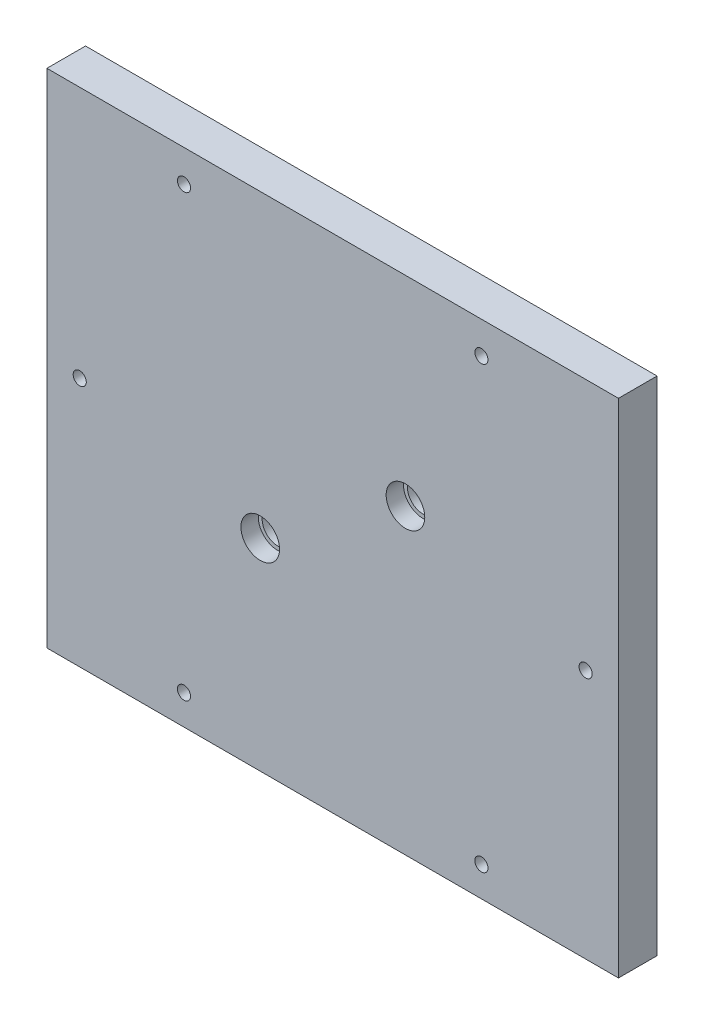
ISO-10303-21;
HEADER;
FILE_DESCRIPTION(('STEP AP214'),'2;1');
FILE_NAME('part.step','',(''),(''),'','','');
FILE_SCHEMA(('AUTOMOTIVE_DESIGN { 1 0 10303 214 1 1 1 1 }'));
ENDSEC;
DATA;
#1=APPLICATION_CONTEXT('core data for automotive mechanical design processes');
#2=APPLICATION_PROTOCOL_DEFINITION('international standard','automotive_design',2000,#1);
#3=PRODUCT_CONTEXT('',#1,'mechanical');
#4=PRODUCT('Part','Part','',(#3));
#5=PRODUCT_RELATED_PRODUCT_CATEGORY('part','',(#4));
#6=PRODUCT_DEFINITION_FORMATION('','',#4);
#7=PRODUCT_DEFINITION_CONTEXT('part definition',#1,'design');
#8=PRODUCT_DEFINITION('design','',#6,#7);
#9=PRODUCT_DEFINITION_SHAPE('','',#8);
#10=(LENGTH_UNIT() NAMED_UNIT(*) SI_UNIT(.MILLI.,.METRE.));
#11=(NAMED_UNIT(*) PLANE_ANGLE_UNIT() SI_UNIT($,.RADIAN.));
#12=(NAMED_UNIT(*) SI_UNIT($,.STERADIAN.) SOLID_ANGLE_UNIT());
#13=UNCERTAINTY_MEASURE_WITH_UNIT(LENGTH_MEASURE(1.E-05),#10,'distance_accuracy_value','');
#14=(GEOMETRIC_REPRESENTATION_CONTEXT(3) GLOBAL_UNCERTAINTY_ASSIGNED_CONTEXT((#13)) GLOBAL_UNIT_ASSIGNED_CONTEXT((#10,
#11,#12)) REPRESENTATION_CONTEXT('',''));
#15=CARTESIAN_POINT('',(0.,0.,0.));
#16=DIRECTION('',(0.,0.,1.));
#17=DIRECTION('',(1.,0.,0.));
#18=AXIS2_PLACEMENT_3D('',#15,#16,#17);
#19=CARTESIAN_POINT('',(-74.0034000000007,189.263400000001,10.));
#20=DIRECTION('',(1.00000000000001,0.,0.));
#21=DIRECTION('',(0.,1.00000000000001,0.));
#22=AXIS2_PLACEMENT_3D('',#19,#20,#21);
#23=PLANE('',#22);
#24=DIRECTION('',(0.,-1.00000000000001,0.));
#25=VECTOR('',#24,1.);
#26=CARTESIAN_POINT('',(-74.0034000000007,189.263400000001,0.));
#27=LINE('',#26,#25);
#28=CARTESIAN_POINT('',(-74.0034000000007,189.263400000001,0.));
#29=VERTEX_POINT('',#28);
#30=CARTESIAN_POINT('',(-74.0034000000003,59.2634000000003,0.));
#31=VERTEX_POINT('',#30);
#32=EDGE_CURVE('E112',#29,#31,#27,.T.);
#33=ORIENTED_EDGE('',*,*,#32,.T.);
#34=DIRECTION('',(0.,0.,-1.));
#35=VECTOR('',#34,1.);
#36=CARTESIAN_POINT('',(-74.0034000000003,59.2634000000003,10.));
#37=LINE('',#36,#35);
#38=CARTESIAN_POINT('',(-74.0034000000003,59.2634000000003,10.));
#39=VERTEX_POINT('',#38);
#40=EDGE_CURVE('E13',#39,#31,#37,.T.);
#41=ORIENTED_EDGE('',*,*,#40,.F.);
#42=DIRECTION('',(0.,-1.00000000000001,0.));
#43=VECTOR('',#42,1.);
#44=CARTESIAN_POINT('',(-74.0034000000007,189.263400000001,10.));
#45=LINE('',#44,#43);
#46=CARTESIAN_POINT('',(-74.0034000000007,189.263400000001,10.));
#47=VERTEX_POINT('',#46);
#48=EDGE_CURVE('E100',#47,#39,#45,.T.);
#49=ORIENTED_EDGE('',*,*,#48,.F.);
#50=DIRECTION('',(0.,0.,-1.));
#51=VECTOR('',#50,1.);
#52=CARTESIAN_POINT('',(-74.0034000000007,189.263400000001,10.));
#53=LINE('',#52,#51);
#54=EDGE_CURVE('E108',#47,#29,#53,.T.);
#55=ORIENTED_EDGE('',*,*,#54,.T.);
#56=EDGE_LOOP('',(#33,#41,#49,#55));
#57=FACE_BOUND('',#56,.T.);
#58=ADVANCED_FACE('F49',(#57),#23,.F.);
#59=CARTESIAN_POINT('',(-74.0034000000003,59.2634000000003,10.));
#60=DIRECTION('',(0.,1.00000000000001,0.));
#61=DIRECTION('',(0.,0.,1.));
#62=AXIS2_PLACEMENT_3D('',#59,#60,#61);
#63=PLANE('',#62);
#64=DIRECTION('',(1.00000000000001,0.,0.));
#65=VECTOR('',#64,1.);
#66=CARTESIAN_POINT('',(-74.0034000000003,59.2634000000003,0.));
#67=LINE('',#66,#65);
#68=CARTESIAN_POINT('',(73.9966000000004,59.2634,0.));
#69=VERTEX_POINT('',#68);
#70=EDGE_CURVE('E104',#31,#69,#67,.T.);
#71=ORIENTED_EDGE('',*,*,#70,.T.);
#72=DIRECTION('',(0.,0.,-1.));
#73=VECTOR('',#72,1.);
#74=CARTESIAN_POINT('',(73.9966000000004,59.2634,10.));
#75=LINE('',#74,#73);
#76=CARTESIAN_POINT('',(73.9966000000004,59.2634,10.));
#77=VERTEX_POINT('',#76);
#78=EDGE_CURVE('E57',#77,#69,#75,.T.);
#79=ORIENTED_EDGE('',*,*,#78,.F.);
#80=DIRECTION('',(1.00000000000001,0.,0.));
#81=VECTOR('',#80,1.);
#82=CARTESIAN_POINT('',(-74.0034000000003,59.2634000000003,10.));
#83=LINE('',#82,#81);
#84=EDGE_CURVE('E95',#39,#77,#83,.T.);
#85=ORIENTED_EDGE('',*,*,#84,.F.);
#86=ORIENTED_EDGE('',*,*,#40,.T.);
#87=EDGE_LOOP('',(#71,#79,#85,#86));
#88=FACE_BOUND('',#87,.T.);
#89=ADVANCED_FACE('F103',(#88),#63,.F.);
#90=CARTESIAN_POINT('',(73.9966,189.263400000001,10.));
#91=DIRECTION('',(-1.00000000000001,0.,0.));
#92=DIRECTION('',(0.,-1.00000000000001,0.));
#93=AXIS2_PLACEMENT_3D('',#90,#91,#92);
#94=PLANE('',#93);
#95=DIRECTION('',(0.,1.00000000000001,0.));
#96=VECTOR('',#95,1.);
#97=CARTESIAN_POINT('',(73.9966,189.263400000001,0.));
#98=LINE('',#97,#96);
#99=CARTESIAN_POINT('',(73.9966,189.263400000001,0.));
#100=VERTEX_POINT('',#99);
#101=EDGE_CURVE('E82',#69,#100,#98,.T.);
#102=ORIENTED_EDGE('',*,*,#101,.T.);
#103=DIRECTION('',(0.,0.,-1.));
#104=VECTOR('',#103,1.);
#105=CARTESIAN_POINT('',(73.9966,189.263400000001,10.));
#106=LINE('',#105,#104);
#107=CARTESIAN_POINT('',(73.9966,189.263400000001,10.));
#108=VERTEX_POINT('',#107);
#109=EDGE_CURVE('E105',#108,#100,#106,.T.);
#110=ORIENTED_EDGE('',*,*,#109,.F.);
#111=DIRECTION('',(0.,1.00000000000001,0.));
#112=VECTOR('',#111,1.);
#113=CARTESIAN_POINT('',(73.9966,189.263400000001,10.));
#114=LINE('',#113,#112);
#115=EDGE_CURVE('E98',#77,#108,#114,.T.);
#116=ORIENTED_EDGE('',*,*,#115,.F.);
#117=ORIENTED_EDGE('',*,*,#78,.T.);
#118=EDGE_LOOP('',(#102,#110,#116,#117));
#119=FACE_BOUND('',#118,.T.);
#120=ADVANCED_FACE('F106',(#119),#94,.F.);
#121=CARTESIAN_POINT('',(-74.0034000000007,189.263400000001,10.));
#122=DIRECTION('',(0.,-1.00000000000001,0.));
#123=DIRECTION('',(0.,0.,-1.));
#124=AXIS2_PLACEMENT_3D('',#121,#122,#123);
#125=PLANE('',#124);
#126=DIRECTION('',(-1.00000000000001,0.,0.));
#127=VECTOR('',#126,1.);
#128=CARTESIAN_POINT('',(-74.0034000000007,189.263400000001,0.));
#129=LINE('',#128,#127);
#130=EDGE_CURVE('E88',#100,#29,#129,.T.);
#131=ORIENTED_EDGE('',*,*,#130,.T.);
#132=ORIENTED_EDGE('',*,*,#54,.F.);
#133=DIRECTION('',(-1.00000000000001,0.,0.));
#134=VECTOR('',#133,1.);
#135=CARTESIAN_POINT('',(-74.0034000000007,189.263400000001,10.));
#136=LINE('',#135,#134);
#137=EDGE_CURVE('E65',#108,#47,#136,.T.);
#138=ORIENTED_EDGE('',*,*,#137,.F.);
#139=ORIENTED_EDGE('',*,*,#109,.T.);
#140=EDGE_LOOP('',(#131,#132,#138,#139));
#141=FACE_BOUND('',#140,.T.);
#142=ADVANCED_FACE('F120',(#141),#125,.F.);
#143=CARTESIAN_POINT('',(-74.0034000000003,59.2634000000003,10.));
#144=DIRECTION('',(0.,0.,1.));
#145=DIRECTION('',(1.00000000000001,0.,0.));
#146=AXIS2_PLACEMENT_3D('',#143,#144,#145);
#147=PLANE('',#146);
#148=CARTESIAN_POINT('',(18.8365999999999,137.5034,10.));
#149=DIRECTION('',(0.,0.,1.));
#150=DIRECTION('',(1.00000000000001,0.,0.));
#151=AXIS2_PLACEMENT_3D('',#148,#149,#150);
#152=CIRCLE('',#151,5.00000000000001);
#153=CARTESIAN_POINT('',(23.8366,137.5034,10.));
#154=VERTEX_POINT('',#153);
#155=EDGE_CURVE('E168',#154,#154,#152,.T.);
#156=ORIENTED_EDGE('',*,*,#155,.F.);
#157=EDGE_LOOP('',(#156));
#158=FACE_BOUND('',#157,.T.);
#159=CARTESIAN_POINT('',(-18.7634000000003,111.523400000001,10.));
#160=DIRECTION('',(0.,0.,1.));
#161=DIRECTION('',(1.00000000000001,0.,0.));
#162=AXIS2_PLACEMENT_3D('',#159,#160,#161);
#163=CIRCLE('',#162,5.);
#164=CARTESIAN_POINT('',(-13.7634000000002,111.523400000001,10.));
#165=VERTEX_POINT('',#164);
#166=EDGE_CURVE('E162',#165,#165,#163,.T.);
#167=ORIENTED_EDGE('',*,*,#166,.F.);
#168=EDGE_LOOP('',(#167));
#169=FACE_BOUND('',#168,.T.);
#170=CARTESIAN_POINT('',(38.5000000000001,67.0000000000007,10.));
#171=DIRECTION('',(0.,0.,1.));
#172=DIRECTION('',(1.00000000000001,0.,0.));
#173=AXIS2_PLACEMENT_3D('',#170,#171,#172);
#174=CIRCLE('',#173,1.7);
#175=CARTESIAN_POINT('',(40.2000000000001,67.0000000000007,10.));
#176=VERTEX_POINT('',#175);
#177=EDGE_CURVE('E158',#176,#176,#174,.T.);
#178=ORIENTED_EDGE('',*,*,#177,.F.);
#179=EDGE_LOOP('',(#178));
#180=FACE_BOUND('',#179,.T.);
#181=CARTESIAN_POINT('',(-38.5068000000002,67.0000000000007,10.));
#182=DIRECTION('',(0.,0.,1.));
#183=DIRECTION('',(1.00000000000001,0.,0.));
#184=AXIS2_PLACEMENT_3D('',#181,#182,#183);
#185=CIRCLE('',#184,1.7);
#186=CARTESIAN_POINT('',(-36.8068000000002,67.0000000000007,10.));
#187=VERTEX_POINT('',#186);
#188=EDGE_CURVE('E152',#187,#187,#185,.T.);
#189=ORIENTED_EDGE('',*,*,#188,.F.);
#190=EDGE_LOOP('',(#189));
#191=FACE_BOUND('',#190,.T.);
#192=CARTESIAN_POINT('',(65.5000000000002,124.000000000001,10.0000000000002));
#193=DIRECTION('',(0.,0.,1.));
#194=DIRECTION('',(1.00000000000001,0.,0.));
#195=AXIS2_PLACEMENT_3D('',#192,#193,#194);
#196=CIRCLE('',#195,1.69999999999999);
#197=CARTESIAN_POINT('',(67.2000000000002,124.000000000001,10.0000000000002));
#198=VERTEX_POINT('',#197);
#199=EDGE_CURVE('E146',#198,#198,#196,.T.);
#200=ORIENTED_EDGE('',*,*,#199,.F.);
#201=EDGE_LOOP('',(#200));
#202=FACE_BOUND('',#201,.T.);
#203=CARTESIAN_POINT('',(-65.5068000000005,124.000000000001,10.0000000000002));
#204=DIRECTION('',(0.,0.,1.));
#205=DIRECTION('',(1.00000000000001,0.,0.));
#206=AXIS2_PLACEMENT_3D('',#203,#204,#205);
#207=CIRCLE('',#206,1.69999999999999);
#208=CARTESIAN_POINT('',(-63.8068000000005,124.000000000001,10.0000000000002));
#209=VERTEX_POINT('',#208);
#210=EDGE_CURVE('E140',#209,#209,#207,.T.);
#211=ORIENTED_EDGE('',*,*,#210,.F.);
#212=EDGE_LOOP('',(#211));
#213=FACE_BOUND('',#212,.T.);
#214=CARTESIAN_POINT('',(-38.5068000000004,181.000000000001,10.));
#215=DIRECTION('',(0.,0.,1.));
#216=DIRECTION('',(1.00000000000001,0.,0.));
#217=AXIS2_PLACEMENT_3D('',#214,#215,#216);
#218=CIRCLE('',#217,1.7);
#219=CARTESIAN_POINT('',(-36.8068000000004,181.000000000001,10.));
#220=VERTEX_POINT('',#219);
#221=EDGE_CURVE('E134',#220,#220,#218,.T.);
#222=ORIENTED_EDGE('',*,*,#221,.F.);
#223=EDGE_LOOP('',(#222));
#224=FACE_BOUND('',#223,.T.);
#225=CARTESIAN_POINT('',(38.5,181.000000000001,10.));
#226=DIRECTION('',(0.,0.,1.));
#227=DIRECTION('',(1.00000000000001,0.,0.));
#228=AXIS2_PLACEMENT_3D('',#225,#226,#227);
#229=CIRCLE('',#228,1.7);
#230=CARTESIAN_POINT('',(40.2,181.000000000001,10.));
#231=VERTEX_POINT('',#230);
#232=EDGE_CURVE('E128',#231,#231,#229,.T.);
#233=ORIENTED_EDGE('',*,*,#232,.F.);
#234=EDGE_LOOP('',(#233));
#235=FACE_BOUND('',#234,.T.);
#236=ORIENTED_EDGE('',*,*,#48,.T.);
#237=ORIENTED_EDGE('',*,*,#84,.T.);
#238=ORIENTED_EDGE('',*,*,#115,.T.);
#239=ORIENTED_EDGE('',*,*,#137,.T.);
#240=EDGE_LOOP('',(#236,#237,#238,#239));
#241=FACE_BOUND('',#240,.T.);
#242=ADVANCED_FACE('F96',(#158,#169,#180,#191,#202,#213,#224,#235,#241),#147,.T.);
#243=CARTESIAN_POINT('',(-74.0034000000003,59.2634000000003,0.));
#244=DIRECTION('',(0.,0.,1.));
#245=DIRECTION('',(1.00000000000001,0.,0.));
#246=AXIS2_PLACEMENT_3D('',#243,#244,#245);
#247=PLANE('',#246);
#248=CARTESIAN_POINT('',(18.8365999999999,137.503400000001,0.));
#249=DIRECTION('',(0.,0.,1.));
#250=DIRECTION('',(1.00000000000001,0.,0.));
#251=AXIS2_PLACEMENT_3D('',#248,#249,#250);
#252=CIRCLE('',#251,4.);
#253=CARTESIAN_POINT('',(22.8365999999999,137.503400000001,0.));
#254=VERTEX_POINT('',#253);
#255=EDGE_CURVE('E179',#254,#254,#252,.F.);
#256=ORIENTED_EDGE('',*,*,#255,.F.);
#257=EDGE_LOOP('',(#256));
#258=FACE_BOUND('',#257,.T.);
#259=CARTESIAN_POINT('',(-18.7634000000003,111.523400000001,0.));
#260=DIRECTION('',(0.,0.,1.));
#261=DIRECTION('',(1.00000000000001,0.,0.));
#262=AXIS2_PLACEMENT_3D('',#259,#260,#261);
#263=CIRCLE('',#262,4.);
#264=CARTESIAN_POINT('',(-14.7634000000002,111.523400000001,0.));
#265=VERTEX_POINT('',#264);
#266=EDGE_CURVE('E171',#265,#265,#263,.F.);
#267=ORIENTED_EDGE('',*,*,#266,.F.);
#268=EDGE_LOOP('',(#267));
#269=FACE_BOUND('',#268,.T.);
#270=CARTESIAN_POINT('',(38.5000000000001,67.0000000000005,0.));
#271=DIRECTION('',(0.,0.,1.));
#272=DIRECTION('',(1.00000000000001,0.,0.));
#273=AXIS2_PLACEMENT_3D('',#270,#271,#272);
#274=CIRCLE('',#273,1.7);
#275=CARTESIAN_POINT('',(40.2000000000001,67.0000000000005,0.));
#276=VERTEX_POINT('',#275);
#277=EDGE_CURVE('E155',#276,#276,#274,.T.);
#278=ORIENTED_EDGE('',*,*,#277,.T.);
#279=EDGE_LOOP('',(#278));
#280=FACE_BOUND('',#279,.T.);
#281=CARTESIAN_POINT('',(-38.5068000000002,67.0000000000005,0.));
#282=DIRECTION('',(0.,0.,1.));
#283=DIRECTION('',(1.00000000000001,0.,0.));
#284=AXIS2_PLACEMENT_3D('',#281,#282,#283);
#285=CIRCLE('',#284,1.7);
#286=CARTESIAN_POINT('',(-36.8068000000002,67.0000000000005,0.));
#287=VERTEX_POINT('',#286);
#288=EDGE_CURVE('E149',#287,#287,#285,.T.);
#289=ORIENTED_EDGE('',*,*,#288,.T.);
#290=EDGE_LOOP('',(#289));
#291=FACE_BOUND('',#290,.T.);
#292=CARTESIAN_POINT('',(65.5000000000002,124.000000000001,2.22044604925031E-13));
#293=DIRECTION('',(0.,0.,1.));
#294=DIRECTION('',(1.00000000000001,0.,0.));
#295=AXIS2_PLACEMENT_3D('',#292,#293,#294);
#296=CIRCLE('',#295,1.69999999999999);
#297=CARTESIAN_POINT('',(67.2000000000002,124.000000000001,2.22044604925031E-13));
#298=VERTEX_POINT('',#297);
#299=EDGE_CURVE('E143',#298,#298,#296,.T.);
#300=ORIENTED_EDGE('',*,*,#299,.T.);
#301=EDGE_LOOP('',(#300));
#302=FACE_BOUND('',#301,.T.);
#303=CARTESIAN_POINT('',(-65.5068000000005,124.000000000001,2.22044604925031E-13));
#304=DIRECTION('',(0.,0.,1.));
#305=DIRECTION('',(1.00000000000001,0.,0.));
#306=AXIS2_PLACEMENT_3D('',#303,#304,#305);
#307=CIRCLE('',#306,1.69999999999999);
#308=CARTESIAN_POINT('',(-63.8068000000005,124.000000000001,2.22044604925031E-13));
#309=VERTEX_POINT('',#308);
#310=EDGE_CURVE('E137',#309,#309,#307,.T.);
#311=ORIENTED_EDGE('',*,*,#310,.T.);
#312=EDGE_LOOP('',(#311));
#313=FACE_BOUND('',#312,.T.);
#314=CARTESIAN_POINT('',(-38.5068000000004,181.000000000001,0.));
#315=DIRECTION('',(0.,0.,1.));
#316=DIRECTION('',(1.00000000000001,0.,0.));
#317=AXIS2_PLACEMENT_3D('',#314,#315,#316);
#318=CIRCLE('',#317,1.7);
#319=CARTESIAN_POINT('',(-36.8068000000004,181.000000000001,0.));
#320=VERTEX_POINT('',#319);
#321=EDGE_CURVE('E131',#320,#320,#318,.T.);
#322=ORIENTED_EDGE('',*,*,#321,.T.);
#323=EDGE_LOOP('',(#322));
#324=FACE_BOUND('',#323,.T.);
#325=CARTESIAN_POINT('',(38.5,181.000000000001,0.));
#326=DIRECTION('',(0.,0.,1.));
#327=DIRECTION('',(1.00000000000001,0.,0.));
#328=AXIS2_PLACEMENT_3D('',#325,#326,#327);
#329=CIRCLE('',#328,1.7);
#330=CARTESIAN_POINT('',(40.2,181.000000000001,0.));
#331=VERTEX_POINT('',#330);
#332=EDGE_CURVE('E115',#331,#331,#329,.T.);
#333=ORIENTED_EDGE('',*,*,#332,.T.);
#334=EDGE_LOOP('',(#333));
#335=FACE_BOUND('',#334,.T.);
#336=ORIENTED_EDGE('',*,*,#32,.F.);
#337=ORIENTED_EDGE('',*,*,#130,.F.);
#338=ORIENTED_EDGE('',*,*,#101,.F.);
#339=ORIENTED_EDGE('',*,*,#70,.F.);
#340=EDGE_LOOP('',(#336,#337,#338,#339));
#341=FACE_BOUND('',#340,.T.);
#342=ADVANCED_FACE('F123',(#258,#269,#280,#291,#302,#313,#324,#335,#341),#247,.F.);
#343=CARTESIAN_POINT('',(38.5,181.000000000001,10.));
#344=DIRECTION('',(0.,0.,1.));
#345=DIRECTION('',(1.00000000000001,0.,0.));
#346=AXIS2_PLACEMENT_3D('',#343,#344,#345);
#347=CYLINDRICAL_SURFACE('',#346,1.7);
#348=ORIENTED_EDGE('',*,*,#332,.F.);
#349=EDGE_LOOP('',(#348));
#350=FACE_BOUND('',#349,.T.);
#351=ORIENTED_EDGE('',*,*,#232,.T.);
#352=EDGE_LOOP('',(#351));
#353=FACE_BOUND('',#352,.T.);
#354=ADVANCED_FACE('F198',(#350,#353),#347,.F.);
#355=CARTESIAN_POINT('',(-38.5068000000004,181.000000000001,10.));
#356=DIRECTION('',(0.,0.,1.));
#357=DIRECTION('',(1.00000000000001,0.,0.));
#358=AXIS2_PLACEMENT_3D('',#355,#356,#357);
#359=CYLINDRICAL_SURFACE('',#358,1.7);
#360=ORIENTED_EDGE('',*,*,#321,.F.);
#361=EDGE_LOOP('',(#360));
#362=FACE_BOUND('',#361,.T.);
#363=ORIENTED_EDGE('',*,*,#221,.T.);
#364=EDGE_LOOP('',(#363));
#365=FACE_BOUND('',#364,.T.);
#366=ADVANCED_FACE('F216',(#362,#365),#359,.F.);
#367=CARTESIAN_POINT('',(-65.5068000000005,124.000000000001,10.0000000000002));
#368=DIRECTION('',(0.,0.,1.));
#369=DIRECTION('',(1.00000000000001,0.,0.));
#370=AXIS2_PLACEMENT_3D('',#367,#368,#369);
#371=CYLINDRICAL_SURFACE('',#370,1.69999999999999);
#372=ORIENTED_EDGE('',*,*,#310,.F.);
#373=EDGE_LOOP('',(#372));
#374=FACE_BOUND('',#373,.T.);
#375=ORIENTED_EDGE('',*,*,#210,.T.);
#376=EDGE_LOOP('',(#375));
#377=FACE_BOUND('',#376,.T.);
#378=ADVANCED_FACE('F260',(#374,#377),#371,.F.);
#379=CARTESIAN_POINT('',(65.5000000000002,124.000000000001,10.0000000000002));
#380=DIRECTION('',(0.,0.,1.));
#381=DIRECTION('',(1.00000000000001,0.,0.));
#382=AXIS2_PLACEMENT_3D('',#379,#380,#381);
#383=CYLINDRICAL_SURFACE('',#382,1.69999999999999);
#384=ORIENTED_EDGE('',*,*,#299,.F.);
#385=EDGE_LOOP('',(#384));
#386=FACE_BOUND('',#385,.T.);
#387=ORIENTED_EDGE('',*,*,#199,.T.);
#388=EDGE_LOOP('',(#387));
#389=FACE_BOUND('',#388,.T.);
#390=ADVANCED_FACE('F268',(#386,#389),#383,.F.);
#391=CARTESIAN_POINT('',(-38.5068000000002,67.0000000000007,10.));
#392=DIRECTION('',(0.,0.,1.));
#393=DIRECTION('',(1.00000000000001,0.,0.));
#394=AXIS2_PLACEMENT_3D('',#391,#392,#393);
#395=CYLINDRICAL_SURFACE('',#394,1.7);
#396=ORIENTED_EDGE('',*,*,#288,.F.);
#397=EDGE_LOOP('',(#396));
#398=FACE_BOUND('',#397,.T.);
#399=ORIENTED_EDGE('',*,*,#188,.T.);
#400=EDGE_LOOP('',(#399));
#401=FACE_BOUND('',#400,.T.);
#402=ADVANCED_FACE('F276',(#398,#401),#395,.F.);
#403=CARTESIAN_POINT('',(38.5000000000001,67.0000000000007,10.));
#404=DIRECTION('',(0.,0.,1.));
#405=DIRECTION('',(1.00000000000001,0.,0.));
#406=AXIS2_PLACEMENT_3D('',#403,#404,#405);
#407=CYLINDRICAL_SURFACE('',#406,1.7);
#408=ORIENTED_EDGE('',*,*,#277,.F.);
#409=EDGE_LOOP('',(#408));
#410=FACE_BOUND('',#409,.T.);
#411=ORIENTED_EDGE('',*,*,#177,.T.);
#412=EDGE_LOOP('',(#411));
#413=FACE_BOUND('',#412,.T.);
#414=ADVANCED_FACE('F284',(#410,#413),#407,.F.);
#415=CARTESIAN_POINT('',(-18.7634000000003,111.5234,5.50000000000001));
#416=DIRECTION('',(0.,0.,1.));
#417=DIRECTION('',(1.00000000000001,0.,0.));
#418=AXIS2_PLACEMENT_3D('',#415,#416,#417);
#419=CYLINDRICAL_SURFACE('',#418,5.);
#420=CARTESIAN_POINT('',(-18.7634000000003,111.5234,5.50000000000001));
#421=DIRECTION('',(0.,0.,1.));
#422=DIRECTION('',(1.00000000000001,0.,0.));
#423=AXIS2_PLACEMENT_3D('',#420,#421,#422);
#424=CIRCLE('',#423,5.);
#425=CARTESIAN_POINT('',(-13.7634000000002,111.5234,5.50000000000001));
#426=VERTEX_POINT('',#425);
#427=EDGE_CURVE('E161',#426,#426,#424,.T.);
#428=ORIENTED_EDGE('',*,*,#427,.F.);
#429=EDGE_LOOP('',(#428));
#430=FACE_BOUND('',#429,.T.);
#431=ORIENTED_EDGE('',*,*,#166,.T.);
#432=EDGE_LOOP('',(#431));
#433=FACE_BOUND('',#432,.T.);
#434=ADVANCED_FACE('F292',(#430,#433),#419,.F.);
#435=CARTESIAN_POINT('',(-18.7634000000003,111.5234,5.50000000000001));
#436=DIRECTION('',(0.,0.,1.));
#437=DIRECTION('',(1.00000000000001,0.,0.));
#438=AXIS2_PLACEMENT_3D('',#435,#436,#437);
#439=PLANE('',#438);
#440=CARTESIAN_POINT('',(-18.7634000000003,111.5234,5.50000000000001));
#441=DIRECTION('',(0.,0.,1.));
#442=DIRECTION('',(1.00000000000001,0.,0.));
#443=AXIS2_PLACEMENT_3D('',#440,#441,#442);
#444=CIRCLE('',#443,4.);
#445=CARTESIAN_POINT('',(-14.7634000000002,111.5234,5.50000000000001));
#446=VERTEX_POINT('',#445);
#447=EDGE_CURVE('E176',#446,#446,#444,.F.);
#448=ORIENTED_EDGE('',*,*,#447,.T.);
#449=EDGE_LOOP('',(#448));
#450=FACE_BOUND('',#449,.T.);
#451=ORIENTED_EDGE('',*,*,#427,.T.);
#452=EDGE_LOOP('',(#451));
#453=FACE_BOUND('',#452,.T.);
#454=ADVANCED_FACE('F300',(#450,#453),#439,.T.);
#455=CARTESIAN_POINT('',(18.8365999999999,137.503400000001,5.50000000000001));
#456=DIRECTION('',(0.,0.,1.));
#457=DIRECTION('',(1.00000000000001,0.,0.));
#458=AXIS2_PLACEMENT_3D('',#455,#456,#457);
#459=CYLINDRICAL_SURFACE('',#458,5.00000000000001);
#460=CARTESIAN_POINT('',(18.8365999999999,137.503400000001,5.50000000000001));
#461=DIRECTION('',(0.,0.,1.));
#462=DIRECTION('',(1.00000000000001,0.,0.));
#463=AXIS2_PLACEMENT_3D('',#460,#461,#462);
#464=CIRCLE('',#463,5.00000000000001);
#465=CARTESIAN_POINT('',(23.8366,137.503400000001,5.50000000000001));
#466=VERTEX_POINT('',#465);
#467=EDGE_CURVE('E165',#466,#466,#464,.T.);
#468=ORIENTED_EDGE('',*,*,#467,.F.);
#469=EDGE_LOOP('',(#468));
#470=FACE_BOUND('',#469,.T.);
#471=ORIENTED_EDGE('',*,*,#155,.T.);
#472=EDGE_LOOP('',(#471));
#473=FACE_BOUND('',#472,.T.);
#474=ADVANCED_FACE('F308',(#470,#473),#459,.F.);
#475=CARTESIAN_POINT('',(18.8365999999999,137.503400000001,5.50000000000001));
#476=DIRECTION('',(0.,0.,1.));
#477=DIRECTION('',(1.00000000000001,0.,0.));
#478=AXIS2_PLACEMENT_3D('',#475,#476,#477);
#479=PLANE('',#478);
#480=CARTESIAN_POINT('',(18.8365999999999,137.503400000001,5.50000000000001));
#481=DIRECTION('',(0.,0.,1.));
#482=DIRECTION('',(1.00000000000001,0.,0.));
#483=AXIS2_PLACEMENT_3D('',#480,#481,#482);
#484=CIRCLE('',#483,4.);
#485=CARTESIAN_POINT('',(22.8365999999999,137.503400000001,5.50000000000001));
#486=VERTEX_POINT('',#485);
#487=EDGE_CURVE('E182',#486,#486,#484,.F.);
#488=ORIENTED_EDGE('',*,*,#487,.T.);
#489=EDGE_LOOP('',(#488));
#490=FACE_BOUND('',#489,.T.);
#491=ORIENTED_EDGE('',*,*,#467,.T.);
#492=EDGE_LOOP('',(#491));
#493=FACE_BOUND('',#492,.T.);
#494=ADVANCED_FACE('F186',(#490,#493),#479,.T.);
#495=CARTESIAN_POINT('',(-18.7634000000003,111.523400000001,-0.000999999999973245));
#496=DIRECTION('',(0.,0.,1.));
#497=DIRECTION('',(1.00000000000001,0.,0.));
#498=AXIS2_PLACEMENT_3D('',#495,#496,#497);
#499=CYLINDRICAL_SURFACE('',#498,4.);
#500=ORIENTED_EDGE('',*,*,#447,.F.);
#501=EDGE_LOOP('',(#500));
#502=FACE_BOUND('',#501,.T.);
#503=ORIENTED_EDGE('',*,*,#266,.T.);
#504=EDGE_LOOP('',(#503));
#505=FACE_BOUND('',#504,.T.);
#506=ADVANCED_FACE('F192',(#502,#505),#499,.F.);
#507=CARTESIAN_POINT('',(18.8365999999999,137.503400000001,-0.001000000000001));
#508=DIRECTION('',(0.,0.,1.));
#509=DIRECTION('',(1.00000000000001,0.,0.));
#510=AXIS2_PLACEMENT_3D('',#507,#508,#509);
#511=CYLINDRICAL_SURFACE('',#510,4.);
#512=ORIENTED_EDGE('',*,*,#487,.F.);
#513=EDGE_LOOP('',(#512));
#514=FACE_BOUND('',#513,.T.);
#515=ORIENTED_EDGE('',*,*,#255,.T.);
#516=EDGE_LOOP('',(#515));
#517=FACE_BOUND('',#516,.T.);
#518=ADVANCED_FACE('F189',(#514,#517),#511,.F.);
#519=CLOSED_SHELL('',(#58,#89,#120,#142,#242,#342,#354,#366,#378,#390,#402,#414,#434,#454,#474,
#494,#506,#518));
#520=MANIFOLD_SOLID_BREP('B2',#519);
#521=ADVANCED_BREP_SHAPE_REPRESENTATION('',(#18,#520),#14);
#522=SHAPE_DEFINITION_REPRESENTATION(#9,#521);
ENDSEC;
END-ISO-10303-21;
